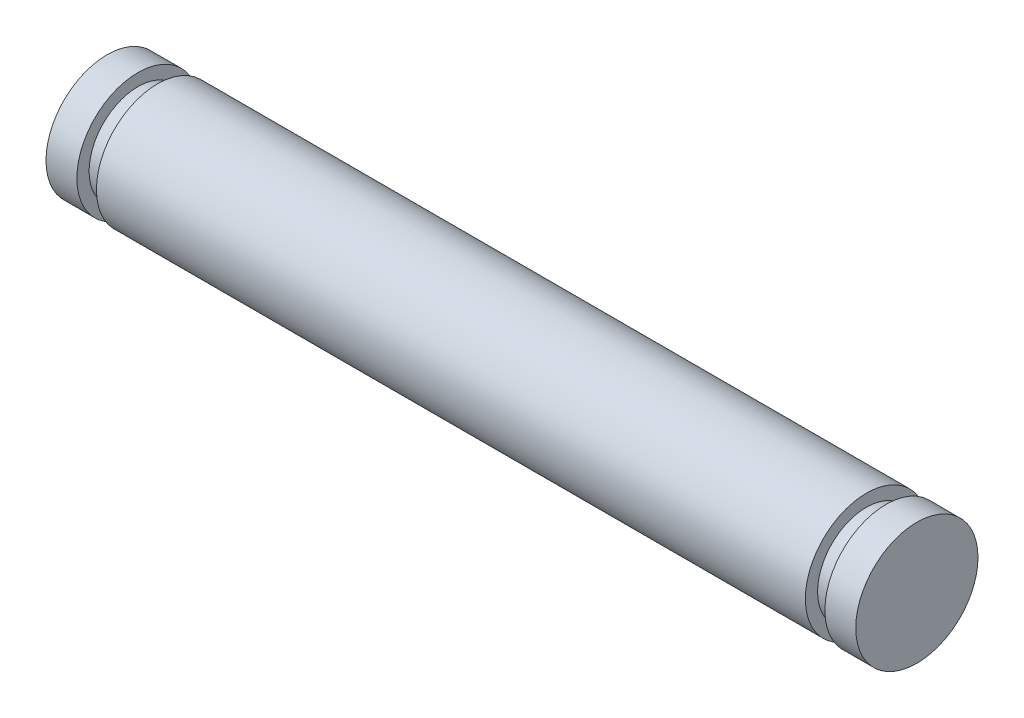
ISO-10303-21;
HEADER;
FILE_DESCRIPTION(('STEP AP214'),'2;1');
FILE_NAME('part.step','',(''),(''),'','','');
FILE_SCHEMA(('AUTOMOTIVE_DESIGN { 1 0 10303 214 1 1 1 1 }'));
ENDSEC;
DATA;
#1=APPLICATION_CONTEXT('core data for automotive mechanical design processes');
#2=APPLICATION_PROTOCOL_DEFINITION('international standard','automotive_design',2000,#1);
#3=PRODUCT_CONTEXT('',#1,'mechanical');
#4=PRODUCT('Part','Part','',(#3));
#5=PRODUCT_RELATED_PRODUCT_CATEGORY('part','',(#4));
#6=PRODUCT_DEFINITION_FORMATION('','',#4);
#7=PRODUCT_DEFINITION_CONTEXT('part definition',#1,'design');
#8=PRODUCT_DEFINITION('design','',#6,#7);
#9=PRODUCT_DEFINITION_SHAPE('','',#8);
#10=(LENGTH_UNIT() NAMED_UNIT(*) SI_UNIT(.MILLI.,.METRE.));
#11=(NAMED_UNIT(*) PLANE_ANGLE_UNIT() SI_UNIT($,.RADIAN.));
#12=(NAMED_UNIT(*) SI_UNIT($,.STERADIAN.) SOLID_ANGLE_UNIT());
#13=UNCERTAINTY_MEASURE_WITH_UNIT(LENGTH_MEASURE(1.E-05),#10,'distance_accuracy_value','');
#14=(GEOMETRIC_REPRESENTATION_CONTEXT(3) GLOBAL_UNCERTAINTY_ASSIGNED_CONTEXT((#13)) GLOBAL_UNIT_ASSIGNED_CONTEXT((#10,
#11,#12)) REPRESENTATION_CONTEXT('',''));
#15=CARTESIAN_POINT('',(0.,0.,0.));
#16=DIRECTION('',(0.,0.,1.));
#17=DIRECTION('',(1.,0.,0.));
#18=AXIS2_PLACEMENT_3D('',#15,#16,#17);
#19=CARTESIAN_POINT('',(13.25,0.,0.));
#20=DIRECTION('',(-1.,0.,0.));
#21=DIRECTION('',(0.,0.,1.));
#22=AXIS2_PLACEMENT_3D('',#19,#20,#21);
#23=CYLINDRICAL_SURFACE('',#22,2.);
#24=CARTESIAN_POINT('',(-11.6,0.,0.));
#25=DIRECTION('',(-1.,0.,0.));
#26=DIRECTION('',(0.,0.,1.));
#27=AXIS2_PLACEMENT_3D('',#24,#25,#26);
#28=CIRCLE('',#27,2.);
#29=CARTESIAN_POINT('',(-11.6,0.,2.));
#30=VERTEX_POINT('',#29);
#31=EDGE_CURVE('E48',#30,#30,#28,.T.);
#32=ORIENTED_EDGE('',*,*,#31,.F.);
#33=EDGE_LOOP('',(#32));
#34=FACE_BOUND('',#33,.T.);
#35=CARTESIAN_POINT('',(11.6,0.,0.));
#36=DIRECTION('',(-1.,0.,0.));
#37=DIRECTION('',(0.,0.,1.));
#38=AXIS2_PLACEMENT_3D('',#35,#36,#37);
#39=CIRCLE('',#38,2.);
#40=CARTESIAN_POINT('',(11.6,0.,2.));
#41=VERTEX_POINT('',#40);
#42=EDGE_CURVE('E60',#41,#41,#39,.T.);
#43=ORIENTED_EDGE('',*,*,#42,.T.);
#44=EDGE_LOOP('',(#43));
#45=FACE_BOUND('',#44,.T.);
#46=ADVANCED_FACE('F30',(#34,#45),#23,.T.);
#47=CARTESIAN_POINT('',(-13.25,0.,0.));
#48=DIRECTION('',(1.,0.,0.));
#49=DIRECTION('',(0.,0.,-1.));
#50=AXIS2_PLACEMENT_3D('',#47,#48,#49);
#51=CIRCLE('',#50,2.);
#52=CARTESIAN_POINT('',(-13.25,0.,-2.));
#53=VERTEX_POINT('',#52);
#54=EDGE_CURVE('E34',#53,#53,#51,.T.);
#55=ORIENTED_EDGE('',*,*,#54,.T.);
#56=EDGE_LOOP('',(#55));
#57=FACE_BOUND('',#56,.T.);
#58=CARTESIAN_POINT('',(-12.24,0.,0.));
#59=DIRECTION('',(-1.,0.,0.));
#60=DIRECTION('',(0.,0.,1.));
#61=AXIS2_PLACEMENT_3D('',#58,#59,#60);
#62=CIRCLE('',#61,2.);
#63=CARTESIAN_POINT('',(-12.24,0.,2.));
#64=VERTEX_POINT('',#63);
#65=EDGE_CURVE('E51',#64,#64,#62,.T.);
#66=ORIENTED_EDGE('',*,*,#65,.T.);
#67=EDGE_LOOP('',(#66));
#68=FACE_BOUND('',#67,.T.);
#69=ADVANCED_FACE('F32',(#57,#68),#23,.T.);
#70=CARTESIAN_POINT('',(-13.25,0.,0.));
#71=DIRECTION('',(1.,0.,0.));
#72=DIRECTION('',(0.,0.,-1.));
#73=AXIS2_PLACEMENT_3D('',#70,#71,#72);
#74=PLANE('',#73);
#75=ORIENTED_EDGE('',*,*,#54,.F.);
#76=EDGE_LOOP('',(#75));
#77=FACE_BOUND('',#76,.T.);
#78=ADVANCED_FACE('F81',(#77),#74,.F.);
#79=CARTESIAN_POINT('',(-12.24,0.,-2.));
#80=DIRECTION('',(1.,0.,0.));
#81=DIRECTION('',(0.,0.,-1.));
#82=AXIS2_PLACEMENT_3D('',#79,#80,#81);
#83=PLANE('',#82);
#84=CARTESIAN_POINT('',(-12.24,0.,0.));
#85=DIRECTION('',(-1.,0.,0.));
#86=DIRECTION('',(0.,0.,1.));
#87=AXIS2_PLACEMENT_3D('',#84,#85,#86);
#88=CIRCLE('',#87,1.6);
#89=CARTESIAN_POINT('',(-12.24,0.,1.6));
#90=VERTEX_POINT('',#89);
#91=EDGE_CURVE('E41',#90,#90,#88,.T.);
#92=ORIENTED_EDGE('',*,*,#91,.T.);
#93=EDGE_LOOP('',(#92));
#94=FACE_BOUND('',#93,.T.);
#95=ORIENTED_EDGE('',*,*,#65,.F.);
#96=EDGE_LOOP('',(#95));
#97=FACE_BOUND('',#96,.T.);
#98=ADVANCED_FACE('F86',(#94,#97),#83,.T.);
#99=CARTESIAN_POINT('',(-14.575,0.,0.));
#100=DIRECTION('',(-1.,0.,0.));
#101=DIRECTION('',(0.,0.,1.));
#102=AXIS2_PLACEMENT_3D('',#99,#100,#101);
#103=CYLINDRICAL_SURFACE('',#102,1.6);
#104=CARTESIAN_POINT('',(-11.6,0.,0.));
#105=DIRECTION('',(-1.,0.,0.));
#106=DIRECTION('',(0.,0.,1.));
#107=AXIS2_PLACEMENT_3D('',#104,#105,#106);
#108=CIRCLE('',#107,1.6);
#109=CARTESIAN_POINT('',(-11.6,0.,1.6));
#110=VERTEX_POINT('',#109);
#111=EDGE_CURVE('E45',#110,#110,#108,.T.);
#112=ORIENTED_EDGE('',*,*,#111,.T.);
#113=EDGE_LOOP('',(#112));
#114=FACE_BOUND('',#113,.T.);
#115=ORIENTED_EDGE('',*,*,#91,.F.);
#116=EDGE_LOOP('',(#115));
#117=FACE_BOUND('',#116,.T.);
#118=ADVANCED_FACE('F93',(#114,#117),#103,.T.);
#119=CARTESIAN_POINT('',(-11.6,0.,-2.));
#120=DIRECTION('',(-1.,0.,0.));
#121=DIRECTION('',(0.,0.,1.));
#122=AXIS2_PLACEMENT_3D('',#119,#120,#121);
#123=PLANE('',#122);
#124=ORIENTED_EDGE('',*,*,#31,.T.);
#125=EDGE_LOOP('',(#124));
#126=FACE_BOUND('',#125,.T.);
#127=ORIENTED_EDGE('',*,*,#111,.F.);
#128=EDGE_LOOP('',(#127));
#129=FACE_BOUND('',#128,.T.);
#130=ADVANCED_FACE('F99',(#126,#129),#123,.T.);
#131=CARTESIAN_POINT('',(12.24,0.,-2.));
#132=DIRECTION('',(-1.,0.,0.));
#133=DIRECTION('',(0.,0.,-1.));
#134=AXIS2_PLACEMENT_3D('',#131,#132,#133);
#135=PLANE('',#134);
#136=CARTESIAN_POINT('',(12.24,0.,0.));
#137=DIRECTION('',(-1.,0.,0.));
#138=DIRECTION('',(0.,0.,1.));
#139=AXIS2_PLACEMENT_3D('',#136,#137,#138);
#140=CIRCLE('',#139,1.6);
#141=CARTESIAN_POINT('',(12.24,0.,1.6));
#142=VERTEX_POINT('',#141);
#143=EDGE_CURVE('E54',#142,#142,#140,.T.);
#144=ORIENTED_EDGE('',*,*,#143,.F.);
#145=EDGE_LOOP('',(#144));
#146=FACE_BOUND('',#145,.T.);
#147=CARTESIAN_POINT('',(12.24,0.,0.));
#148=DIRECTION('',(-1.,0.,0.));
#149=DIRECTION('',(0.,0.,1.));
#150=AXIS2_PLACEMENT_3D('',#147,#148,#149);
#151=CIRCLE('',#150,2.);
#152=CARTESIAN_POINT('',(12.24,0.,2.));
#153=VERTEX_POINT('',#152);
#154=EDGE_CURVE('E63',#153,#153,#151,.T.);
#155=ORIENTED_EDGE('',*,*,#154,.T.);
#156=EDGE_LOOP('',(#155));
#157=FACE_BOUND('',#156,.T.);
#158=ADVANCED_FACE('F67',(#146,#157),#135,.T.);
#159=CARTESIAN_POINT('',(14.575,0.,0.));
#160=DIRECTION('',(1.,0.,0.));
#161=DIRECTION('',(0.,0.,1.));
#162=AXIS2_PLACEMENT_3D('',#159,#160,#161);
#163=CYLINDRICAL_SURFACE('',#162,1.6);
#164=CARTESIAN_POINT('',(11.6,0.,0.));
#165=DIRECTION('',(-1.,0.,0.));
#166=DIRECTION('',(0.,0.,1.));
#167=AXIS2_PLACEMENT_3D('',#164,#165,#166);
#168=CIRCLE('',#167,1.6);
#169=CARTESIAN_POINT('',(11.6,0.,1.6));
#170=VERTEX_POINT('',#169);
#171=EDGE_CURVE('E57',#170,#170,#168,.T.);
#172=ORIENTED_EDGE('',*,*,#171,.F.);
#173=EDGE_LOOP('',(#172));
#174=FACE_BOUND('',#173,.T.);
#175=ORIENTED_EDGE('',*,*,#143,.T.);
#176=EDGE_LOOP('',(#175));
#177=FACE_BOUND('',#176,.T.);
#178=ADVANCED_FACE('F108',(#174,#177),#163,.T.);
#179=CARTESIAN_POINT('',(11.6,0.,-2.));
#180=DIRECTION('',(1.,0.,0.));
#181=DIRECTION('',(0.,0.,1.));
#182=AXIS2_PLACEMENT_3D('',#179,#180,#181);
#183=PLANE('',#182);
#184=ORIENTED_EDGE('',*,*,#42,.F.);
#185=EDGE_LOOP('',(#184));
#186=FACE_BOUND('',#185,.T.);
#187=ORIENTED_EDGE('',*,*,#171,.T.);
#188=EDGE_LOOP('',(#187));
#189=FACE_BOUND('',#188,.T.);
#190=ADVANCED_FACE('F76',(#186,#189),#183,.T.);
#191=CARTESIAN_POINT('',(13.25,0.,0.));
#192=DIRECTION('',(1.,0.,0.));
#193=DIRECTION('',(0.,0.,-1.));
#194=AXIS2_PLACEMENT_3D('',#191,#192,#193);
#195=PLANE('',#194);
#196=CARTESIAN_POINT('',(13.25,0.,0.));
#197=DIRECTION('',(1.,0.,0.));
#198=DIRECTION('',(0.,0.,-1.));
#199=AXIS2_PLACEMENT_3D('',#196,#197,#198);
#200=CIRCLE('',#199,2.);
#201=CARTESIAN_POINT('',(13.25,0.,-2.));
#202=VERTEX_POINT('',#201);
#203=EDGE_CURVE('E10',#202,#202,#200,.T.);
#204=ORIENTED_EDGE('',*,*,#203,.T.);
#205=EDGE_LOOP('',(#204));
#206=FACE_BOUND('',#205,.T.);
#207=ADVANCED_FACE('F71',(#206),#195,.T.);
#208=ORIENTED_EDGE('',*,*,#203,.F.);
#209=EDGE_LOOP('',(#208));
#210=FACE_BOUND('',#209,.T.);
#211=ORIENTED_EDGE('',*,*,#154,.F.);
#212=EDGE_LOOP('',(#211));
#213=FACE_BOUND('',#212,.T.);
#214=ADVANCED_FACE('F69',(#210,#213),#23,.T.);
#215=CLOSED_SHELL('',(#46,#69,#78,#98,#118,#130,#158,#178,#190,#207,#214));
#216=MANIFOLD_SOLID_BREP('B2',#215);
#217=ADVANCED_BREP_SHAPE_REPRESENTATION('',(#18,#216),#14);
#218=SHAPE_DEFINITION_REPRESENTATION(#9,#217);
ENDSEC;
END-ISO-10303-21;
